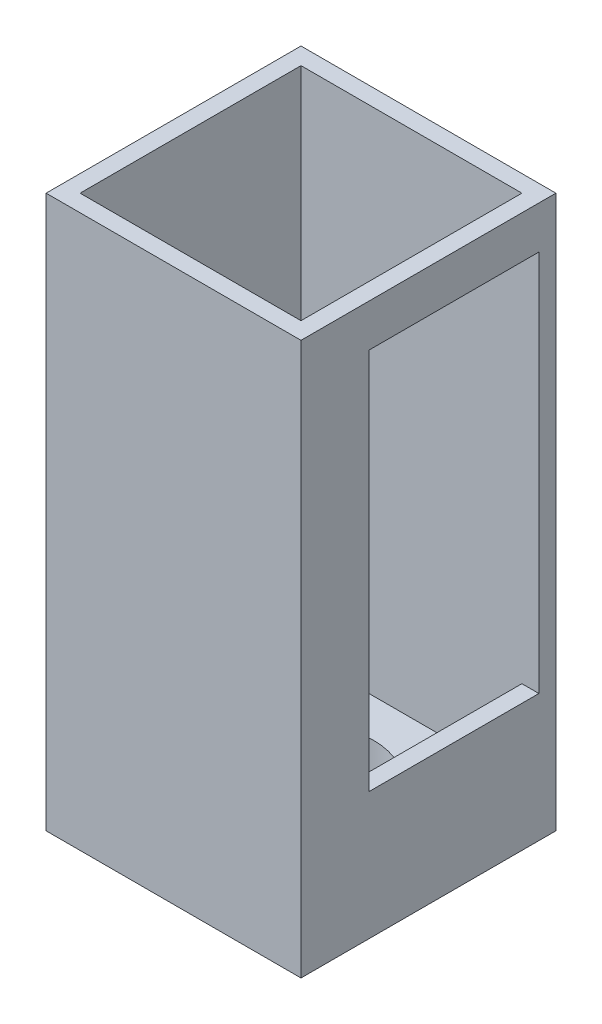
ISO-10303-21;
HEADER;
FILE_DESCRIPTION(('STEP AP214'),'2;1');
FILE_NAME('part.step','',(''),(''),'','','');
FILE_SCHEMA(('AUTOMOTIVE_DESIGN { 1 0 10303 214 1 1 1 1 }'));
ENDSEC;
DATA;
#1=APPLICATION_CONTEXT('core data for automotive mechanical design processes');
#2=APPLICATION_PROTOCOL_DEFINITION('international standard','automotive_design',2000,#1);
#3=PRODUCT_CONTEXT('',#1,'mechanical');
#4=PRODUCT('Part','Part','',(#3));
#5=PRODUCT_RELATED_PRODUCT_CATEGORY('part','',(#4));
#6=PRODUCT_DEFINITION_FORMATION('','',#4);
#7=PRODUCT_DEFINITION_CONTEXT('part definition',#1,'design');
#8=PRODUCT_DEFINITION('design','',#6,#7);
#9=PRODUCT_DEFINITION_SHAPE('','',#8);
#10=(LENGTH_UNIT() NAMED_UNIT(*) SI_UNIT(.MILLI.,.METRE.));
#11=(NAMED_UNIT(*) PLANE_ANGLE_UNIT() SI_UNIT($,.RADIAN.));
#12=(NAMED_UNIT(*) SI_UNIT($,.STERADIAN.) SOLID_ANGLE_UNIT());
#13=UNCERTAINTY_MEASURE_WITH_UNIT(LENGTH_MEASURE(1.E-05),#10,'distance_accuracy_value','');
#14=(GEOMETRIC_REPRESENTATION_CONTEXT(3) GLOBAL_UNCERTAINTY_ASSIGNED_CONTEXT((#13)) GLOBAL_UNIT_ASSIGNED_CONTEXT((#10,
#11,#12)) REPRESENTATION_CONTEXT('',''));
#15=CARTESIAN_POINT('',(0.,0.,0.));
#16=DIRECTION('',(0.,0.,1.));
#17=DIRECTION('',(1.,0.,0.));
#18=AXIS2_PLACEMENT_3D('',#15,#16,#17);
#19=CARTESIAN_POINT('',(13.,-41.7695526217005,13.));
#20=DIRECTION('',(1.,0.,0.));
#21=DIRECTION('',(0.,0.,-1.));
#22=AXIS2_PLACEMENT_3D('',#19,#20,#21);
#23=PLANE('',#22);
#24=DIRECTION('',(0.,0.,1.));
#25=VECTOR('',#24,1.);
#26=CARTESIAN_POINT('',(13.,0.,13.));
#27=LINE('',#26,#25);
#28=CARTESIAN_POINT('',(13.,0.,-13.));
#29=VERTEX_POINT('',#28);
#30=CARTESIAN_POINT('',(13.,0.,13.));
#31=VERTEX_POINT('',#30);
#32=EDGE_CURVE('E147',#29,#31,#27,.T.);
#33=ORIENTED_EDGE('',*,*,#32,.T.);
#34=DIRECTION('',(0.,1.,0.));
#35=VECTOR('',#34,1.);
#36=CARTESIAN_POINT('',(13.,-41.7695526217005,13.));
#37=LINE('',#36,#35);
#38=CARTESIAN_POINT('',(13.,60.,13.));
#39=VERTEX_POINT('',#38);
#40=EDGE_CURVE('E132',#31,#39,#37,.T.);
#41=ORIENTED_EDGE('',*,*,#40,.T.);
#42=DIRECTION('',(0.,0.,-1.));
#43=VECTOR('',#42,1.);
#44=CARTESIAN_POINT('',(13.,60.,13.));
#45=LINE('',#44,#43);
#46=CARTESIAN_POINT('',(13.,60.,-13.));
#47=VERTEX_POINT('',#46);
#48=EDGE_CURVE('E205',#39,#47,#45,.T.);
#49=ORIENTED_EDGE('',*,*,#48,.T.);
#50=DIRECTION('',(0.,1.,0.));
#51=VECTOR('',#50,1.);
#52=CARTESIAN_POINT('',(13.,-41.7695526217005,-13.));
#53=LINE('',#52,#51);
#54=CARTESIAN_POINT('',(13.,55.,-13.));
#55=VERTEX_POINT('',#54);
#56=EDGE_CURVE('E200',#55,#47,#53,.T.);
#57=ORIENTED_EDGE('',*,*,#56,.F.);
#58=DIRECTION('',(0.,0.,-1.));
#59=VECTOR('',#58,1.);
#60=CARTESIAN_POINT('',(13.,55.,7.));
#61=LINE('',#60,#59);
#62=CARTESIAN_POINT('',(13.,55.,7.));
#63=VERTEX_POINT('',#62);
#64=EDGE_CURVE('E162',#63,#55,#61,.T.);
#65=ORIENTED_EDGE('',*,*,#64,.F.);
#66=DIRECTION('',(0.,1.,0.));
#67=VECTOR('',#66,1.);
#68=CARTESIAN_POINT('',(13.,10.,7.));
#69=LINE('',#68,#67);
#70=CARTESIAN_POINT('',(13.,10.,7.));
#71=VERTEX_POINT('',#70);
#72=EDGE_CURVE('E166',#71,#63,#69,.T.);
#73=ORIENTED_EDGE('',*,*,#72,.F.);
#74=DIRECTION('',(0.,0.,1.));
#75=VECTOR('',#74,1.);
#76=CARTESIAN_POINT('',(13.,10.,7.));
#77=LINE('',#76,#75);
#78=CARTESIAN_POINT('',(13.,10.,-13.));
#79=VERTEX_POINT('',#78);
#80=EDGE_CURVE('E169',#79,#71,#77,.T.);
#81=ORIENTED_EDGE('',*,*,#80,.F.);
#82=EDGE_CURVE('E149',#29,#79,#53,.T.);
#83=ORIENTED_EDGE('',*,*,#82,.F.);
#84=EDGE_LOOP('',(#33,#41,#49,#57,#65,#73,#81,#83));
#85=FACE_BOUND('',#84,.T.);
#86=ADVANCED_FACE('F41',(#85),#23,.F.);
#87=CARTESIAN_POINT('',(13.,-41.7695526217005,-13.));
#88=DIRECTION('',(0.,0.,-1.));
#89=DIRECTION('',(-1.,0.,0.));
#90=AXIS2_PLACEMENT_3D('',#87,#88,#89);
#91=PLANE('',#90);
#92=DIRECTION('',(1.,0.,0.));
#93=VECTOR('',#92,1.);
#94=CARTESIAN_POINT('',(-13.,0.,-13.));
#95=LINE('',#94,#93);
#96=CARTESIAN_POINT('',(-13.,0.,-13.));
#97=VERTEX_POINT('',#96);
#98=EDGE_CURVE('E59',#97,#29,#95,.T.);
#99=ORIENTED_EDGE('',*,*,#98,.T.);
#100=ORIENTED_EDGE('',*,*,#82,.T.);
#101=DIRECTION('',(1.,0.,0.));
#102=VECTOR('',#101,1.);
#103=CARTESIAN_POINT('',(-36.2442890089805,10.,-13.));
#104=LINE('',#103,#102);
#105=CARTESIAN_POINT('',(15.,10.,-13.));
#106=VERTEX_POINT('',#105);
#107=EDGE_CURVE('E188',#79,#106,#104,.T.);
#108=ORIENTED_EDGE('',*,*,#107,.T.);
#109=DIRECTION('',(0.,1.,0.));
#110=VECTOR('',#109,1.);
#111=CARTESIAN_POINT('',(15.,10.,-13.));
#112=LINE('',#111,#110);
#113=CARTESIAN_POINT('',(15.,55.,-13.));
#114=VERTEX_POINT('',#113);
#115=EDGE_CURVE('E174',#106,#114,#112,.T.);
#116=ORIENTED_EDGE('',*,*,#115,.T.);
#117=DIRECTION('',(1.,0.,0.));
#118=VECTOR('',#117,1.);
#119=CARTESIAN_POINT('',(-36.2442890089805,55.,-13.));
#120=LINE('',#119,#118);
#121=EDGE_CURVE('E185',#55,#114,#120,.T.);
#122=ORIENTED_EDGE('',*,*,#121,.F.);
#123=ORIENTED_EDGE('',*,*,#56,.T.);
#124=DIRECTION('',(-1.,0.,0.));
#125=VECTOR('',#124,1.);
#126=CARTESIAN_POINT('',(13.,60.,-13.));
#127=LINE('',#126,#125);
#128=CARTESIAN_POINT('',(-13.,60.,-13.));
#129=VERTEX_POINT('',#128);
#130=EDGE_CURVE('E201',#47,#129,#127,.T.);
#131=ORIENTED_EDGE('',*,*,#130,.T.);
#132=DIRECTION('',(0.,1.,0.));
#133=VECTOR('',#132,1.);
#134=CARTESIAN_POINT('',(-13.,-41.7695526217005,-13.));
#135=LINE('',#134,#133);
#136=EDGE_CURVE('E212',#97,#129,#135,.T.);
#137=ORIENTED_EDGE('',*,*,#136,.F.);
#138=EDGE_LOOP('',(#99,#100,#108,#116,#122,#123,#131,#137));
#139=FACE_BOUND('',#138,.T.);
#140=ADVANCED_FACE('F279',(#139),#91,.F.);
#141=CARTESIAN_POINT('',(-13.,-41.7695526217005,-13.));
#142=DIRECTION('',(-1.,0.,0.));
#143=DIRECTION('',(0.,0.,1.));
#144=AXIS2_PLACEMENT_3D('',#141,#142,#143);
#145=PLANE('',#144);
#146=DIRECTION('',(0.,0.,-1.));
#147=VECTOR('',#146,1.);
#148=CARTESIAN_POINT('',(-13.,0.,13.));
#149=LINE('',#148,#147);
#150=CARTESIAN_POINT('',(-13.,0.,13.));
#151=VERTEX_POINT('',#150);
#152=EDGE_CURVE('E67',#151,#97,#149,.T.);
#153=ORIENTED_EDGE('',*,*,#152,.T.);
#154=ORIENTED_EDGE('',*,*,#136,.T.);
#155=DIRECTION('',(0.,0.,1.));
#156=VECTOR('',#155,1.);
#157=CARTESIAN_POINT('',(-13.,60.,-13.));
#158=LINE('',#157,#156);
#159=CARTESIAN_POINT('',(-13.,60.,13.));
#160=VERTEX_POINT('',#159);
#161=EDGE_CURVE('E196',#129,#160,#158,.T.);
#162=ORIENTED_EDGE('',*,*,#161,.T.);
#163=DIRECTION('',(0.,1.,0.));
#164=VECTOR('',#163,1.);
#165=CARTESIAN_POINT('',(-13.,-41.7695526217005,13.));
#166=LINE('',#165,#164);
#167=EDGE_CURVE('E144',#151,#160,#166,.T.);
#168=ORIENTED_EDGE('',*,*,#167,.F.);
#169=EDGE_LOOP('',(#153,#154,#162,#168));
#170=FACE_BOUND('',#169,.T.);
#171=ADVANCED_FACE('F285',(#170),#145,.F.);
#172=CARTESIAN_POINT('',(-13.,-41.7695526217005,13.));
#173=DIRECTION('',(0.,0.,1.));
#174=DIRECTION('',(1.,0.,0.));
#175=AXIS2_PLACEMENT_3D('',#172,#173,#174);
#176=PLANE('',#175);
#177=DIRECTION('',(-1.,0.,0.));
#178=VECTOR('',#177,1.);
#179=CARTESIAN_POINT('',(-13.,0.,13.));
#180=LINE('',#179,#178);
#181=EDGE_CURVE('E136',#31,#151,#180,.T.);
#182=ORIENTED_EDGE('',*,*,#181,.T.);
#183=ORIENTED_EDGE('',*,*,#167,.T.);
#184=DIRECTION('',(1.,0.,0.));
#185=VECTOR('',#184,1.);
#186=CARTESIAN_POINT('',(-13.,60.,13.));
#187=LINE('',#186,#185);
#188=EDGE_CURVE('E138',#160,#39,#187,.T.);
#189=ORIENTED_EDGE('',*,*,#188,.T.);
#190=ORIENTED_EDGE('',*,*,#40,.F.);
#191=EDGE_LOOP('',(#182,#183,#189,#190));
#192=FACE_BOUND('',#191,.T.);
#193=ADVANCED_FACE('F134',(#192),#176,.F.);
#194=CARTESIAN_POINT('',(15.,-5.,15.));
#195=DIRECTION('',(1.,0.,0.));
#196=DIRECTION('',(0.,0.,-1.));
#197=AXIS2_PLACEMENT_3D('',#194,#195,#196);
#198=PLANE('',#197);
#199=DIRECTION('',(0.,-1.,0.));
#200=VECTOR('',#199,1.);
#201=CARTESIAN_POINT('',(15.,10.,7.));
#202=LINE('',#201,#200);
#203=CARTESIAN_POINT('',(15.,55.,7.));
#204=VERTEX_POINT('',#203);
#205=CARTESIAN_POINT('',(15.,10.,7.));
#206=VERTEX_POINT('',#205);
#207=EDGE_CURVE('E155',#204,#206,#202,.T.);
#208=ORIENTED_EDGE('',*,*,#207,.F.);
#209=DIRECTION('',(0.,0.,1.));
#210=VECTOR('',#209,1.);
#211=CARTESIAN_POINT('',(15.,55.,7.));
#212=LINE('',#211,#210);
#213=EDGE_CURVE('E178',#114,#204,#212,.T.);
#214=ORIENTED_EDGE('',*,*,#213,.F.);
#215=ORIENTED_EDGE('',*,*,#115,.F.);
#216=DIRECTION('',(0.,0.,-1.));
#217=VECTOR('',#216,1.);
#218=CARTESIAN_POINT('',(15.,10.,7.));
#219=LINE('',#218,#217);
#220=EDGE_CURVE('E158',#206,#106,#219,.T.);
#221=ORIENTED_EDGE('',*,*,#220,.F.);
#222=EDGE_LOOP('',(#208,#214,#215,#221));
#223=FACE_BOUND('',#222,.T.);
#224=DIRECTION('',(0.,1.,0.));
#225=VECTOR('',#224,1.);
#226=CARTESIAN_POINT('',(15.,-5.,-15.));
#227=LINE('',#226,#225);
#228=CARTESIAN_POINT('',(15.,-5.,-15.));
#229=VERTEX_POINT('',#228);
#230=CARTESIAN_POINT('',(15.,60.,-15.));
#231=VERTEX_POINT('',#230);
#232=EDGE_CURVE('E45',#229,#231,#227,.T.);
#233=ORIENTED_EDGE('',*,*,#232,.T.);
#234=DIRECTION('',(0.,0.,-1.));
#235=VECTOR('',#234,1.);
#236=CARTESIAN_POINT('',(15.,60.,15.));
#237=LINE('',#236,#235);
#238=CARTESIAN_POINT('',(15.,60.,15.));
#239=VERTEX_POINT('',#238);
#240=EDGE_CURVE('E143',#239,#231,#237,.T.);
#241=ORIENTED_EDGE('',*,*,#240,.F.);
#242=DIRECTION('',(0.,1.,0.));
#243=VECTOR('',#242,1.);
#244=CARTESIAN_POINT('',(15.,-5.,15.));
#245=LINE('',#244,#243);
#246=CARTESIAN_POINT('',(15.,-5.,15.));
#247=VERTEX_POINT('',#246);
#248=EDGE_CURVE('E11',#247,#239,#245,.T.);
#249=ORIENTED_EDGE('',*,*,#248,.F.);
#250=DIRECTION('',(0.,0.,-1.));
#251=VECTOR('',#250,1.);
#252=CARTESIAN_POINT('',(15.,-5.,15.));
#253=LINE('',#252,#251);
#254=EDGE_CURVE('E232',#247,#229,#253,.T.);
#255=ORIENTED_EDGE('',*,*,#254,.T.);
#256=EDGE_LOOP('',(#233,#241,#249,#255));
#257=FACE_BOUND('',#256,.T.);
#258=ADVANCED_FACE('F43',(#223,#257),#198,.T.);
#259=CARTESIAN_POINT('',(-15.,-5.,15.));
#260=DIRECTION('',(0.,0.,1.));
#261=DIRECTION('',(1.,0.,0.));
#262=AXIS2_PLACEMENT_3D('',#259,#260,#261);
#263=PLANE('',#262);
#264=ORIENTED_EDGE('',*,*,#248,.T.);
#265=DIRECTION('',(1.,0.,0.));
#266=VECTOR('',#265,1.);
#267=CARTESIAN_POINT('',(-15.,60.,15.));
#268=LINE('',#267,#266);
#269=CARTESIAN_POINT('',(-15.,60.,15.));
#270=VERTEX_POINT('',#269);
#271=EDGE_CURVE('E228',#270,#239,#268,.T.);
#272=ORIENTED_EDGE('',*,*,#271,.F.);
#273=DIRECTION('',(0.,1.,0.));
#274=VECTOR('',#273,1.);
#275=CARTESIAN_POINT('',(-15.,-5.,15.));
#276=LINE('',#275,#274);
#277=CARTESIAN_POINT('',(-15.,-5.,15.));
#278=VERTEX_POINT('',#277);
#279=EDGE_CURVE('E51',#278,#270,#276,.T.);
#280=ORIENTED_EDGE('',*,*,#279,.F.);
#281=DIRECTION('',(1.,0.,0.));
#282=VECTOR('',#281,1.);
#283=CARTESIAN_POINT('',(-15.,-5.,15.));
#284=LINE('',#283,#282);
#285=EDGE_CURVE('E244',#278,#247,#284,.T.);
#286=ORIENTED_EDGE('',*,*,#285,.T.);
#287=EDGE_LOOP('',(#264,#272,#280,#286));
#288=FACE_BOUND('',#287,.T.);
#289=ADVANCED_FACE('F264',(#288),#263,.T.);
#290=CARTESIAN_POINT('',(-15.,-5.,15.));
#291=DIRECTION('',(-1.,0.,0.));
#292=DIRECTION('',(0.,0.,1.));
#293=AXIS2_PLACEMENT_3D('',#290,#291,#292);
#294=PLANE('',#293);
#295=ORIENTED_EDGE('',*,*,#279,.T.);
#296=DIRECTION('',(0.,0.,1.));
#297=VECTOR('',#296,1.);
#298=CARTESIAN_POINT('',(-15.,60.,15.));
#299=LINE('',#298,#297);
#300=CARTESIAN_POINT('',(-15.,60.,-15.));
#301=VERTEX_POINT('',#300);
#302=EDGE_CURVE('E224',#301,#270,#299,.T.);
#303=ORIENTED_EDGE('',*,*,#302,.F.);
#304=DIRECTION('',(0.,1.,0.));
#305=VECTOR('',#304,1.);
#306=CARTESIAN_POINT('',(-15.,-5.,-15.));
#307=LINE('',#306,#305);
#308=CARTESIAN_POINT('',(-15.,-5.,-15.));
#309=VERTEX_POINT('',#308);
#310=EDGE_CURVE('E249',#309,#301,#307,.T.);
#311=ORIENTED_EDGE('',*,*,#310,.F.);
#312=DIRECTION('',(0.,0.,1.));
#313=VECTOR('',#312,1.);
#314=CARTESIAN_POINT('',(-15.,-5.,15.));
#315=LINE('',#314,#313);
#316=EDGE_CURVE('E240',#309,#278,#315,.T.);
#317=ORIENTED_EDGE('',*,*,#316,.T.);
#318=EDGE_LOOP('',(#295,#303,#311,#317));
#319=FACE_BOUND('',#318,.T.);
#320=ADVANCED_FACE('F270',(#319),#294,.T.);
#321=CARTESIAN_POINT('',(-15.,-5.,-15.));
#322=DIRECTION('',(0.,0.,-1.));
#323=DIRECTION('',(-1.,0.,0.));
#324=AXIS2_PLACEMENT_3D('',#321,#322,#323);
#325=PLANE('',#324);
#326=ORIENTED_EDGE('',*,*,#310,.T.);
#327=DIRECTION('',(-1.,0.,0.));
#328=VECTOR('',#327,1.);
#329=CARTESIAN_POINT('',(-15.,60.,-15.));
#330=LINE('',#329,#328);
#331=EDGE_CURVE('E220',#231,#301,#330,.T.);
#332=ORIENTED_EDGE('',*,*,#331,.F.);
#333=ORIENTED_EDGE('',*,*,#232,.F.);
#334=DIRECTION('',(-1.,0.,0.));
#335=VECTOR('',#334,1.);
#336=CARTESIAN_POINT('',(-15.,-5.,-15.));
#337=LINE('',#336,#335);
#338=EDGE_CURVE('E236',#229,#309,#337,.T.);
#339=ORIENTED_EDGE('',*,*,#338,.T.);
#340=EDGE_LOOP('',(#326,#332,#333,#339));
#341=FACE_BOUND('',#340,.T.);
#342=ADVANCED_FACE('F258',(#341),#325,.T.);
#343=CARTESIAN_POINT('',(0.,-5.,0.));
#344=DIRECTION('',(0.,-1.,0.));
#345=DIRECTION('',(0.,0.,-1.));
#346=AXIS2_PLACEMENT_3D('',#343,#344,#345);
#347=PLANE('',#346);
#348=CARTESIAN_POINT('',(0.,-5.,0.));
#349=DIRECTION('',(0.,-1.,0.));
#350=DIRECTION('',(0.,0.,-1.));
#351=AXIS2_PLACEMENT_3D('',#348,#349,#350);
#352=CIRCLE('',#351,8.5);
#353=CARTESIAN_POINT('',(0.,-5.,-8.5));
#354=VERTEX_POINT('',#353);
#355=EDGE_CURVE('E301',#354,#354,#352,.T.);
#356=ORIENTED_EDGE('',*,*,#355,.F.);
#357=EDGE_LOOP('',(#356));
#358=FACE_BOUND('',#357,.T.);
#359=ORIENTED_EDGE('',*,*,#254,.F.);
#360=ORIENTED_EDGE('',*,*,#285,.F.);
#361=ORIENTED_EDGE('',*,*,#316,.F.);
#362=ORIENTED_EDGE('',*,*,#338,.F.);
#363=EDGE_LOOP('',(#359,#360,#361,#362));
#364=FACE_BOUND('',#363,.T.);
#365=ADVANCED_FACE('F267',(#358,#364),#347,.T.);
#366=CARTESIAN_POINT('',(0.,60.,0.));
#367=DIRECTION('',(0.,-1.,0.));
#368=DIRECTION('',(0.,0.,-1.));
#369=AXIS2_PLACEMENT_3D('',#366,#367,#368);
#370=PLANE('',#369);
#371=ORIENTED_EDGE('',*,*,#130,.F.);
#372=ORIENTED_EDGE('',*,*,#48,.F.);
#373=ORIENTED_EDGE('',*,*,#188,.F.);
#374=ORIENTED_EDGE('',*,*,#161,.F.);
#375=EDGE_LOOP('',(#371,#372,#373,#374));
#376=FACE_BOUND('',#375,.T.);
#377=ORIENTED_EDGE('',*,*,#240,.T.);
#378=ORIENTED_EDGE('',*,*,#331,.T.);
#379=ORIENTED_EDGE('',*,*,#302,.T.);
#380=ORIENTED_EDGE('',*,*,#271,.T.);
#381=EDGE_LOOP('',(#377,#378,#379,#380));
#382=FACE_BOUND('',#381,.T.);
#383=ADVANCED_FACE('F261',(#376,#382),#370,.F.);
#384=CARTESIAN_POINT('',(-36.2442890089805,10.,7.));
#385=DIRECTION('',(0.,0.,1.));
#386=DIRECTION('',(1.,0.,0.));
#387=AXIS2_PLACEMENT_3D('',#384,#385,#386);
#388=PLANE('',#387);
#389=ORIENTED_EDGE('',*,*,#72,.T.);
#390=DIRECTION('',(1.,0.,0.));
#391=VECTOR('',#390,1.);
#392=CARTESIAN_POINT('',(-36.2442890089805,55.,7.));
#393=LINE('',#392,#391);
#394=EDGE_CURVE('E167',#63,#204,#393,.T.);
#395=ORIENTED_EDGE('',*,*,#394,.T.);
#396=ORIENTED_EDGE('',*,*,#207,.T.);
#397=DIRECTION('',(1.,0.,0.));
#398=VECTOR('',#397,1.);
#399=CARTESIAN_POINT('',(-36.2442890089805,10.,7.));
#400=LINE('',#399,#398);
#401=EDGE_CURVE('E182',#71,#206,#400,.T.);
#402=ORIENTED_EDGE('',*,*,#401,.F.);
#403=EDGE_LOOP('',(#389,#395,#396,#402));
#404=FACE_BOUND('',#403,.T.);
#405=ADVANCED_FACE('F291',(#404),#388,.F.);
#406=CARTESIAN_POINT('',(-36.2442890089805,55.,7.));
#407=DIRECTION('',(0.,1.,0.));
#408=DIRECTION('',(0.,0.,1.));
#409=AXIS2_PLACEMENT_3D('',#406,#407,#408);
#410=PLANE('',#409);
#411=ORIENTED_EDGE('',*,*,#64,.T.);
#412=ORIENTED_EDGE('',*,*,#121,.T.);
#413=ORIENTED_EDGE('',*,*,#213,.T.);
#414=ORIENTED_EDGE('',*,*,#394,.F.);
#415=EDGE_LOOP('',(#411,#412,#413,#414));
#416=FACE_BOUND('',#415,.T.);
#417=ADVANCED_FACE('F323',(#416),#410,.F.);
#418=CARTESIAN_POINT('',(-36.2442890089805,10.,7.));
#419=DIRECTION('',(0.,-1.,0.));
#420=DIRECTION('',(0.,0.,-1.));
#421=AXIS2_PLACEMENT_3D('',#418,#419,#420);
#422=PLANE('',#421);
#423=ORIENTED_EDGE('',*,*,#80,.T.);
#424=ORIENTED_EDGE('',*,*,#401,.T.);
#425=ORIENTED_EDGE('',*,*,#220,.T.);
#426=ORIENTED_EDGE('',*,*,#107,.F.);
#427=EDGE_LOOP('',(#423,#424,#425,#426));
#428=FACE_BOUND('',#427,.T.);
#429=ADVANCED_FACE('F316',(#428),#422,.F.);
#430=CARTESIAN_POINT('',(0.,0.,0.));
#431=DIRECTION('',(0.,-1.,0.));
#432=DIRECTION('',(0.,0.,-1.));
#433=AXIS2_PLACEMENT_3D('',#430,#431,#432);
#434=PLANE('',#433);
#435=CARTESIAN_POINT('',(0.,0.,0.));
#436=DIRECTION('',(0.,-1.,0.));
#437=DIRECTION('',(0.,0.,-1.));
#438=AXIS2_PLACEMENT_3D('',#435,#436,#437);
#439=CIRCLE('',#438,8.5);
#440=CARTESIAN_POINT('',(0.,0.,-8.5));
#441=VERTEX_POINT('',#440);
#442=EDGE_CURVE('E304',#441,#441,#439,.F.);
#443=ORIENTED_EDGE('',*,*,#442,.F.);
#444=EDGE_LOOP('',(#443));
#445=FACE_BOUND('',#444,.T.);
#446=ORIENTED_EDGE('',*,*,#152,.F.);
#447=ORIENTED_EDGE('',*,*,#181,.F.);
#448=ORIENTED_EDGE('',*,*,#32,.F.);
#449=ORIENTED_EDGE('',*,*,#98,.F.);
#450=EDGE_LOOP('',(#446,#447,#448,#449));
#451=FACE_BOUND('',#450,.T.);
#452=ADVANCED_FACE('F153',(#445,#451),#434,.F.);
#453=CARTESIAN_POINT('',(0.,24.0416305603426,0.));
#454=DIRECTION('',(0.,-1.,0.));
#455=DIRECTION('',(0.,0.,-1.));
#456=AXIS2_PLACEMENT_3D('',#453,#454,#455);
#457=CYLINDRICAL_SURFACE('',#456,8.5);
#458=CARTESIAN_POINT('',(0.,0.,-8.5));
#459=CARTESIAN_POINT('',(0.,-0.0520833333333334,-8.5));
#460=CARTESIAN_POINT('',(0.,-0.104166666666667,-8.5));
#461=CARTESIAN_POINT('',(0.,-0.208333333333334,-8.5));
#462=CARTESIAN_POINT('',(0.,-0.260416666666667,-8.5));
#463=CARTESIAN_POINT('',(0.,-0.364583333333334,-8.5));
#464=CARTESIAN_POINT('',(0.,-0.416666666666667,-8.5));
#465=CARTESIAN_POINT('',(0.,-0.520833333333334,-8.5));
#466=CARTESIAN_POINT('',(0.,-0.572916666666667,-8.5));
#467=CARTESIAN_POINT('',(0.,-0.677083333333334,-8.5));
#468=CARTESIAN_POINT('',(0.,-0.729166666666667,-8.5));
#469=CARTESIAN_POINT('',(0.,-0.833333333333334,-8.5));
#470=CARTESIAN_POINT('',(0.,-0.885416666666668,-8.5));
#471=CARTESIAN_POINT('',(0.,-0.989583333333334,-8.5));
#472=CARTESIAN_POINT('',(0.,-1.04166666666667,-8.5));
#473=CARTESIAN_POINT('',(0.,-1.14583333333333,-8.5));
#474=CARTESIAN_POINT('',(0.,-1.19791666666667,-8.5));
#475=CARTESIAN_POINT('',(0.,-1.30208333333333,-8.5));
#476=CARTESIAN_POINT('',(0.,-1.35416666666667,-8.5));
#477=CARTESIAN_POINT('',(0.,-1.45833333333333,-8.5));
#478=CARTESIAN_POINT('',(0.,-1.51041666666666,-8.5));
#479=CARTESIAN_POINT('',(0.,-1.61458333333333,-8.5));
#480=CARTESIAN_POINT('',(0.,-1.66666666666666,-8.5));
#481=CARTESIAN_POINT('',(0.,-1.77083333333333,-8.5));
#482=CARTESIAN_POINT('',(0.,-1.82291666666666,-8.5));
#483=CARTESIAN_POINT('',(0.,-1.92708333333333,-8.5));
#484=CARTESIAN_POINT('',(0.,-1.97916666666667,-8.5));
#485=CARTESIAN_POINT('',(0.,-2.08333333333333,-8.5));
#486=CARTESIAN_POINT('',(0.,-2.13541666666667,-8.5));
#487=CARTESIAN_POINT('',(0.,-2.23958333333333,-8.5));
#488=CARTESIAN_POINT('',(0.,-2.29166666666667,-8.5));
#489=CARTESIAN_POINT('',(0.,-2.39583333333333,-8.5));
#490=CARTESIAN_POINT('',(0.,-2.44791666666667,-8.5));
#491=CARTESIAN_POINT('',(0.,-2.55208333333333,-8.5));
#492=CARTESIAN_POINT('',(0.,-2.60416666666667,-8.5));
#493=CARTESIAN_POINT('',(0.,-2.70833333333333,-8.5));
#494=CARTESIAN_POINT('',(0.,-2.76041666666667,-8.5));
#495=CARTESIAN_POINT('',(0.,-2.86458333333333,-8.5));
#496=CARTESIAN_POINT('',(0.,-2.91666666666667,-8.5));
#497=CARTESIAN_POINT('',(0.,-3.02083333333333,-8.5));
#498=CARTESIAN_POINT('',(0.,-3.07291666666667,-8.5));
#499=CARTESIAN_POINT('',(0.,-3.17708333333333,-8.5));
#500=CARTESIAN_POINT('',(0.,-3.22916666666667,-8.5));
#501=CARTESIAN_POINT('',(0.,-3.33333333333333,-8.5));
#502=CARTESIAN_POINT('',(0.,-3.38541666666667,-8.5));
#503=CARTESIAN_POINT('',(0.,-3.48958333333333,-8.5));
#504=CARTESIAN_POINT('',(0.,-3.54166666666667,-8.5));
#505=CARTESIAN_POINT('',(0.,-3.64583333333333,-8.5));
#506=CARTESIAN_POINT('',(0.,-3.69791666666666,-8.5));
#507=CARTESIAN_POINT('',(0.,-3.80208333333333,-8.5));
#508=CARTESIAN_POINT('',(0.,-3.85416666666667,-8.5));
#509=CARTESIAN_POINT('',(0.,-3.95833333333333,-8.5));
#510=CARTESIAN_POINT('',(0.,-4.01041666666666,-8.5));
#511=CARTESIAN_POINT('',(0.,-4.11458333333333,-8.5));
#512=CARTESIAN_POINT('',(0.,-4.16666666666666,-8.5));
#513=CARTESIAN_POINT('',(0.,-4.27083333333333,-8.5));
#514=CARTESIAN_POINT('',(0.,-4.32291666666666,-8.5));
#515=CARTESIAN_POINT('',(0.,-4.42708333333333,-8.5));
#516=CARTESIAN_POINT('',(0.,-4.47916666666666,-8.5));
#517=CARTESIAN_POINT('',(0.,-4.58333333333333,-8.5));
#518=CARTESIAN_POINT('',(0.,-4.63541666666666,-8.5));
#519=CARTESIAN_POINT('',(0.,-4.73958333333333,-8.5));
#520=CARTESIAN_POINT('',(0.,-4.79166666666666,-8.5));
#521=CARTESIAN_POINT('',(0.,-4.89583333333333,-8.5));
#522=CARTESIAN_POINT('',(0.,-4.94791666666666,-8.5));
#523=CARTESIAN_POINT('',(0.,-5.,-8.5));
#524=B_SPLINE_CURVE_WITH_KNOTS('',3,(#458,#459,#460,#461,#462,#463,#464,#465,#466,#467,#468,
#469,#470,#471,#472,#473,#474,#475,#476,#477,#478,#479,#480,#481,#482,#483,#484,#485,#486,#487,
#488,#489,#490,#491,#492,#493,#494,#495,#496,#497,#498,#499,#500,#501,#502,#503,#504,#505,#506,
#507,#508,#509,#510,#511,#512,#513,#514,#515,#516,#517,#518,#519,#520,#521,#522,#523),
.UNSPECIFIED.,.F.,.F.,(4,2,2,2,2,2,2,2,2,2,2,2,2,2,2,2,2,2,2,2,2,2,2,2,2,2,2,2,2,2,2,2,4),(0.,
0.15625,0.3125,0.46875,0.625000000000001,0.781250000000001,0.937500000000001,1.09375,1.25,
1.40625,1.5625,1.71875,1.875,2.03125,2.1875,2.34375,2.5,2.65625,2.8125,2.96875,3.125,3.28125,
3.4375,3.59375,3.75,3.90625,4.0625,4.21875,4.375,4.53125,4.6875,4.84375,5.),.UNSPECIFIED.);
#525=EDGE_CURVE('BSEAM314',#441,#354,#524,.T.);
#526=ORIENTED_EDGE('',*,*,#442,.T.);
#527=ORIENTED_EDGE('',*,*,#355,.T.);
#528=ORIENTED_EDGE('',*,*,#525,.T.);
#529=ORIENTED_EDGE('',*,*,#525,.F.);
#530=EDGE_LOOP('',(#526,#528,#527,#529));
#531=FACE_BOUND('',#530,.T.);
#532=ADVANCED_FACE('F314',(#531),#457,.F.);
#533=CLOSED_SHELL('',(#86,#140,#171,#193,#258,#289,#320,#342,#365,#383,#405,#417,#429,#452,#532));
#534=MANIFOLD_SOLID_BREP('B2',#533);
#535=ADVANCED_BREP_SHAPE_REPRESENTATION('',(#18,#534),#14);
#536=SHAPE_DEFINITION_REPRESENTATION(#9,#535);
ENDSEC;
END-ISO-10303-21;
